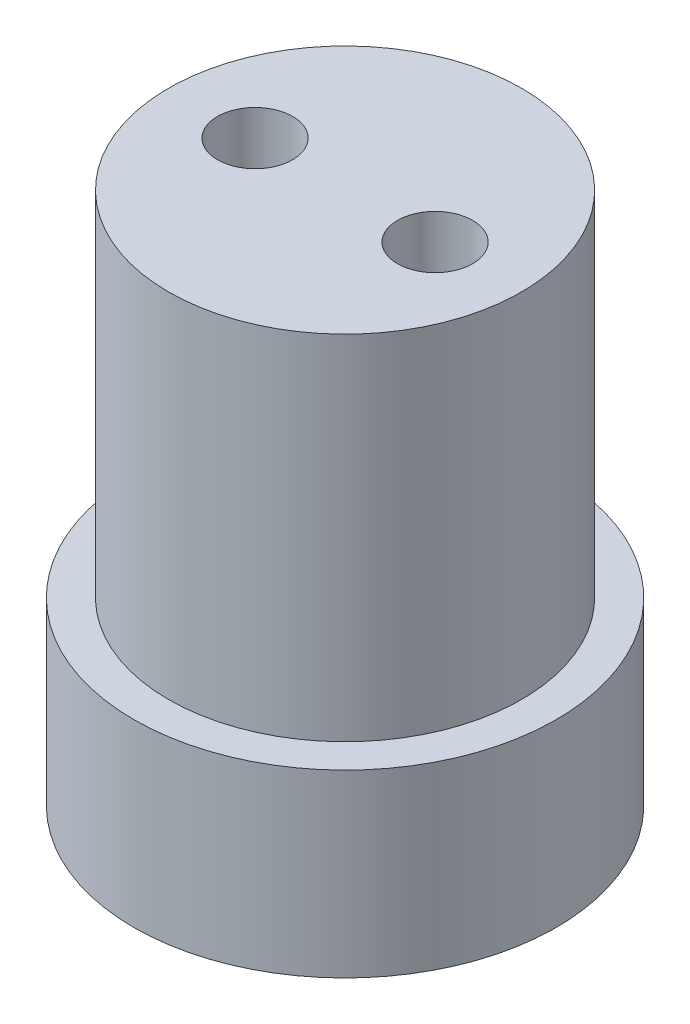
ISO-10303-21;
HEADER;
FILE_DESCRIPTION(('STEP AP214'),'2;1');
FILE_NAME('part.step','',(''),(''),'','','');
FILE_SCHEMA(('AUTOMOTIVE_DESIGN { 1 0 10303 214 1 1 1 1 }'));
ENDSEC;
DATA;
#1=APPLICATION_CONTEXT('core data for automotive mechanical design processes');
#2=APPLICATION_PROTOCOL_DEFINITION('international standard','automotive_design',2000,#1);
#3=PRODUCT_CONTEXT('',#1,'mechanical');
#4=PRODUCT('Part','Part','',(#3));
#5=PRODUCT_RELATED_PRODUCT_CATEGORY('part','',(#4));
#6=PRODUCT_DEFINITION_FORMATION('','',#4);
#7=PRODUCT_DEFINITION_CONTEXT('part definition',#1,'design');
#8=PRODUCT_DEFINITION('design','',#6,#7);
#9=PRODUCT_DEFINITION_SHAPE('','',#8);
#10=(LENGTH_UNIT() NAMED_UNIT(*) SI_UNIT(.MILLI.,.METRE.));
#11=(NAMED_UNIT(*) PLANE_ANGLE_UNIT() SI_UNIT($,.RADIAN.));
#12=(NAMED_UNIT(*) SI_UNIT($,.STERADIAN.) SOLID_ANGLE_UNIT());
#13=UNCERTAINTY_MEASURE_WITH_UNIT(LENGTH_MEASURE(1.E-05),#10,'distance_accuracy_value','');
#14=(GEOMETRIC_REPRESENTATION_CONTEXT(3) GLOBAL_UNCERTAINTY_ASSIGNED_CONTEXT((#13)) GLOBAL_UNIT_ASSIGNED_CONTEXT((#10,
#11,#12)) REPRESENTATION_CONTEXT('',''));
#15=CARTESIAN_POINT('',(0.,0.,0.));
#16=DIRECTION('',(0.,0.,1.));
#17=DIRECTION('',(1.,0.,0.));
#18=AXIS2_PLACEMENT_3D('',#15,#16,#17);
#19=CARTESIAN_POINT('',(0.,0.,0.));
#20=DIRECTION('',(0.,1.,0.));
#21=DIRECTION('',(0.,0.,1.));
#22=AXIS2_PLACEMENT_3D('',#19,#20,#21);
#23=PLANE('',#22);
#24=CARTESIAN_POINT('',(0.,0.,0.));
#25=DIRECTION('',(0.,1.,0.));
#26=DIRECTION('',(0.,0.,1.));
#27=AXIS2_PLACEMENT_3D('',#24,#25,#26);
#28=CIRCLE('',#27,1.49);
#29=CARTESIAN_POINT('',(0.,0.,1.49));
#30=VERTEX_POINT('',#29);
#31=EDGE_CURVE('E18',#30,#30,#28,.T.);
#32=ORIENTED_EDGE('',*,*,#31,.F.);
#33=EDGE_LOOP('',(#32));
#34=FACE_BOUND('',#33,.T.);
#35=CARTESIAN_POINT('',(0.635,0.,0.));
#36=DIRECTION('',(0.,1.,0.));
#37=DIRECTION('',(0.,0.,1.));
#38=AXIS2_PLACEMENT_3D('',#35,#36,#37);
#39=CIRCLE('',#38,0.265);
#40=CARTESIAN_POINT('',(0.635,0.,0.265));
#41=VERTEX_POINT('',#40);
#42=EDGE_CURVE('E38',#41,#41,#39,.T.);
#43=ORIENTED_EDGE('',*,*,#42,.T.);
#44=EDGE_LOOP('',(#43));
#45=FACE_BOUND('',#44,.T.);
#46=CARTESIAN_POINT('',(-0.635,0.,0.));
#47=DIRECTION('',(0.,1.,0.));
#48=DIRECTION('',(0.,0.,1.));
#49=AXIS2_PLACEMENT_3D('',#46,#47,#48);
#50=CIRCLE('',#49,0.265);
#51=CARTESIAN_POINT('',(-0.635,0.,0.265));
#52=VERTEX_POINT('',#51);
#53=EDGE_CURVE('E40',#52,#52,#50,.T.);
#54=ORIENTED_EDGE('',*,*,#53,.T.);
#55=EDGE_LOOP('',(#54));
#56=FACE_BOUND('',#55,.T.);
#57=ADVANCED_FACE('F15',(#34,#45,#56),#23,.F.);
#58=CARTESIAN_POINT('',(0.,3.69040339472804,0.));
#59=DIRECTION('',(0.,1.,0.));
#60=DIRECTION('',(0.,0.,1.));
#61=AXIS2_PLACEMENT_3D('',#58,#59,#60);
#62=CYLINDRICAL_SURFACE('',#61,1.49);
#63=CARTESIAN_POINT('',(0.,1.27,0.));
#64=DIRECTION('',(0.,1.,0.));
#65=DIRECTION('',(0.,0.,1.));
#66=AXIS2_PLACEMENT_3D('',#63,#64,#65);
#67=CIRCLE('',#66,1.49);
#68=CARTESIAN_POINT('',(0.,1.27,1.49));
#69=VERTEX_POINT('',#68);
#70=EDGE_CURVE('E35',#69,#69,#67,.F.);
#71=ORIENTED_EDGE('',*,*,#70,.T.);
#72=EDGE_LOOP('',(#71));
#73=FACE_BOUND('',#72,.T.);
#74=ORIENTED_EDGE('',*,*,#31,.T.);
#75=EDGE_LOOP('',(#74));
#76=FACE_BOUND('',#75,.T.);
#77=ADVANCED_FACE('F47',(#73,#76),#62,.T.);
#78=CARTESIAN_POINT('',(-0.635,0.,0.));
#79=DIRECTION('',(0.,1.,0.));
#80=DIRECTION('',(0.,0.,1.));
#81=AXIS2_PLACEMENT_3D('',#78,#79,#80);
#82=CYLINDRICAL_SURFACE('',#81,0.265);
#83=ORIENTED_EDGE('',*,*,#53,.F.);
#84=EDGE_LOOP('',(#83));
#85=FACE_BOUND('',#84,.T.);
#86=CARTESIAN_POINT('',(-0.635,3.76,0.));
#87=DIRECTION('',(0.,1.,0.));
#88=DIRECTION('',(0.,0.,1.));
#89=AXIS2_PLACEMENT_3D('',#86,#87,#88);
#90=CIRCLE('',#89,0.265);
#91=CARTESIAN_POINT('',(-0.635,3.76,0.265));
#92=VERTEX_POINT('',#91);
#93=EDGE_CURVE('E32',#92,#92,#90,.T.);
#94=ORIENTED_EDGE('',*,*,#93,.T.);
#95=EDGE_LOOP('',(#94));
#96=FACE_BOUND('',#95,.T.);
#97=ADVANCED_FACE('F57',(#85,#96),#82,.F.);
#98=CARTESIAN_POINT('',(0.635,0.,0.));
#99=DIRECTION('',(0.,1.,0.));
#100=DIRECTION('',(0.,0.,1.));
#101=AXIS2_PLACEMENT_3D('',#98,#99,#100);
#102=CYLINDRICAL_SURFACE('',#101,0.265);
#103=ORIENTED_EDGE('',*,*,#42,.F.);
#104=EDGE_LOOP('',(#103));
#105=FACE_BOUND('',#104,.T.);
#106=CARTESIAN_POINT('',(0.635,3.76,0.));
#107=DIRECTION('',(0.,1.,0.));
#108=DIRECTION('',(0.,0.,1.));
#109=AXIS2_PLACEMENT_3D('',#106,#107,#108);
#110=CIRCLE('',#109,0.265);
#111=CARTESIAN_POINT('',(0.635,3.76,0.265));
#112=VERTEX_POINT('',#111);
#113=EDGE_CURVE('E27',#112,#112,#110,.T.);
#114=ORIENTED_EDGE('',*,*,#113,.T.);
#115=EDGE_LOOP('',(#114));
#116=FACE_BOUND('',#115,.T.);
#117=ADVANCED_FACE('F53',(#105,#116),#102,.F.);
#118=CARTESIAN_POINT('',(1.49,1.27,0.));
#119=DIRECTION('',(0.,-1.,0.));
#120=DIRECTION('',(0.,0.,-1.));
#121=AXIS2_PLACEMENT_3D('',#118,#119,#120);
#122=PLANE('',#121);
#123=ORIENTED_EDGE('',*,*,#70,.F.);
#124=EDGE_LOOP('',(#123));
#125=FACE_BOUND('',#124,.T.);
#126=CARTESIAN_POINT('',(0.,1.27,0.));
#127=DIRECTION('',(0.,1.,0.));
#128=DIRECTION('',(0.,0.,1.));
#129=AXIS2_PLACEMENT_3D('',#126,#127,#128);
#130=CIRCLE('',#129,1.245);
#131=CARTESIAN_POINT('',(0.,1.27,1.245));
#132=VERTEX_POINT('',#131);
#133=EDGE_CURVE('E22',#132,#132,#130,.T.);
#134=ORIENTED_EDGE('',*,*,#133,.F.);
#135=EDGE_LOOP('',(#134));
#136=FACE_BOUND('',#135,.T.);
#137=ADVANCED_FACE('F56',(#125,#136),#122,.F.);
#138=CARTESIAN_POINT('',(1.245,3.76,0.));
#139=DIRECTION('',(0.,-1.,0.));
#140=DIRECTION('',(0.,0.,-1.));
#141=AXIS2_PLACEMENT_3D('',#138,#139,#140);
#142=PLANE('',#141);
#143=CARTESIAN_POINT('',(0.,3.76,0.));
#144=DIRECTION('',(0.,1.,0.));
#145=DIRECTION('',(0.,0.,1.));
#146=AXIS2_PLACEMENT_3D('',#143,#144,#145);
#147=CIRCLE('',#146,1.245);
#148=CARTESIAN_POINT('',(0.,3.76,1.245));
#149=VERTEX_POINT('',#148);
#150=EDGE_CURVE('E10',#149,#149,#147,.F.);
#151=ORIENTED_EDGE('',*,*,#150,.F.);
#152=EDGE_LOOP('',(#151));
#153=FACE_BOUND('',#152,.T.);
#154=ORIENTED_EDGE('',*,*,#113,.F.);
#155=EDGE_LOOP('',(#154));
#156=FACE_BOUND('',#155,.T.);
#157=ORIENTED_EDGE('',*,*,#93,.F.);
#158=EDGE_LOOP('',(#157));
#159=FACE_BOUND('',#158,.T.);
#160=ADVANCED_FACE('F61',(#153,#156,#159),#142,.F.);
#161=CARTESIAN_POINT('',(0.,3.69040339472804,0.));
#162=DIRECTION('',(0.,1.,0.));
#163=DIRECTION('',(0.,0.,1.));
#164=AXIS2_PLACEMENT_3D('',#161,#162,#163);
#165=CYLINDRICAL_SURFACE('',#164,1.245);
#166=ORIENTED_EDGE('',*,*,#150,.T.);
#167=EDGE_LOOP('',(#166));
#168=FACE_BOUND('',#167,.T.);
#169=ORIENTED_EDGE('',*,*,#133,.T.);
#170=EDGE_LOOP('',(#169));
#171=FACE_BOUND('',#170,.T.);
#172=ADVANCED_FACE('F64',(#168,#171),#165,.T.);
#173=CLOSED_SHELL('',(#57,#77,#97,#117,#137,#160,#172));
#174=MANIFOLD_SOLID_BREP('B1',#173);
#175=ADVANCED_BREP_SHAPE_REPRESENTATION('',(#18,#174),#14);
#176=SHAPE_DEFINITION_REPRESENTATION(#9,#175);
ENDSEC;
END-ISO-10303-21;
